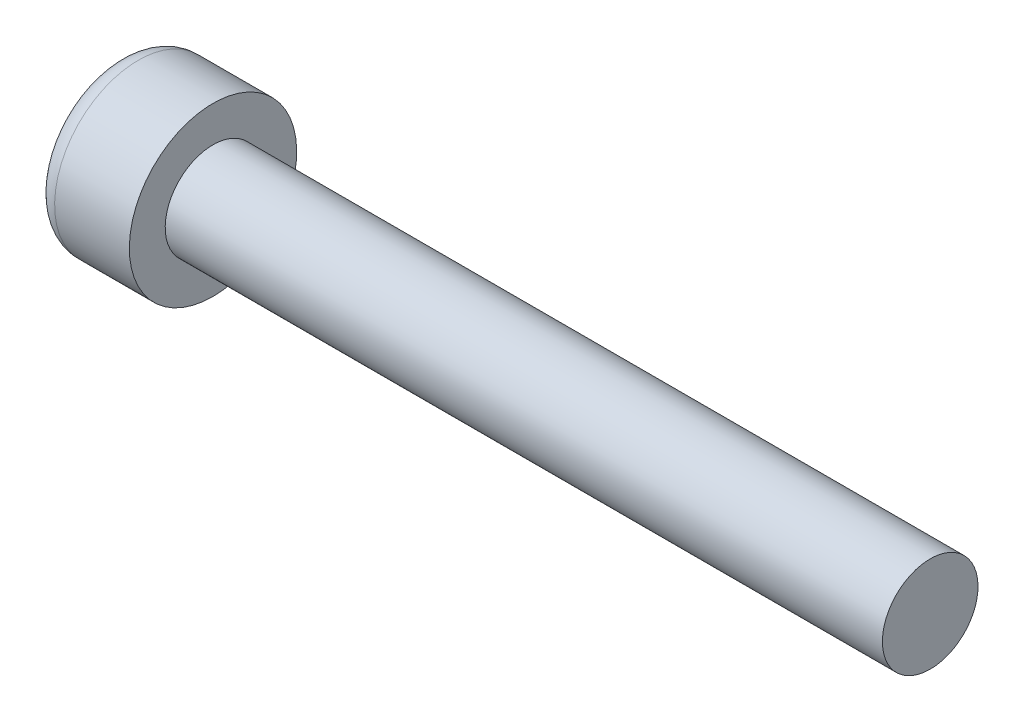
ISO-10303-21;
HEADER;
FILE_DESCRIPTION(('STEP AP214'),'2;1');
FILE_NAME('part.step','',(''),(''),'','','');
FILE_SCHEMA(('AUTOMOTIVE_DESIGN { 1 0 10303 214 1 1 1 1 }'));
ENDSEC;
DATA;
#1=APPLICATION_CONTEXT('core data for automotive mechanical design processes');
#2=APPLICATION_PROTOCOL_DEFINITION('international standard','automotive_design',2000,#1);
#3=PRODUCT_CONTEXT('',#1,'mechanical');
#4=PRODUCT('Part','Part','',(#3));
#5=PRODUCT_RELATED_PRODUCT_CATEGORY('part','',(#4));
#6=PRODUCT_DEFINITION_FORMATION('','',#4);
#7=PRODUCT_DEFINITION_CONTEXT('part definition',#1,'design');
#8=PRODUCT_DEFINITION('design','',#6,#7);
#9=PRODUCT_DEFINITION_SHAPE('','',#8);
#10=(LENGTH_UNIT() NAMED_UNIT(*) SI_UNIT(.MILLI.,.METRE.));
#11=(NAMED_UNIT(*) PLANE_ANGLE_UNIT() SI_UNIT($,.RADIAN.));
#12=(NAMED_UNIT(*) SI_UNIT($,.STERADIAN.) SOLID_ANGLE_UNIT());
#13=UNCERTAINTY_MEASURE_WITH_UNIT(LENGTH_MEASURE(1.E-05),#10,'distance_accuracy_value','');
#14=(GEOMETRIC_REPRESENTATION_CONTEXT(3) GLOBAL_UNCERTAINTY_ASSIGNED_CONTEXT((#13)) GLOBAL_UNIT_ASSIGNED_CONTEXT((#10,
#11,#12)) REPRESENTATION_CONTEXT('',''));
#15=CARTESIAN_POINT('',(0.,0.,0.));
#16=DIRECTION('',(0.,0.,1.));
#17=DIRECTION('',(1.,0.,0.));
#18=AXIS2_PLACEMENT_3D('',#15,#16,#17);
#19=CARTESIAN_POINT('',(0.,0.,0.));
#20=DIRECTION('',(1.,0.,0.));
#21=DIRECTION('',(0.,1.,0.));
#22=AXIS2_PLACEMENT_3D('',#19,#20,#21);
#23=PLANE('',#22);
#24=DIRECTION('',(0.,-0.5,-0.866025403784439));
#25=VECTOR('',#24,1.);
#26=CARTESIAN_POINT('',(0.,1.73205080756888,0.));
#27=LINE('',#26,#25);
#28=CARTESIAN_POINT('',(0.,1.73205080756888,0.));
#29=VERTEX_POINT('',#28);
#30=CARTESIAN_POINT('',(0.,0.866025403784439,-1.5));
#31=VERTEX_POINT('',#30);
#32=EDGE_CURVE('E123',#29,#31,#27,.T.);
#33=ORIENTED_EDGE('',*,*,#32,.F.);
#34=DIRECTION('',(0.,0.5,-0.866025403784439));
#35=VECTOR('',#34,1.);
#36=CARTESIAN_POINT('',(0.,0.866025403784439,1.5));
#37=LINE('',#36,#35);
#38=CARTESIAN_POINT('',(0.,0.866025403784439,1.5));
#39=VERTEX_POINT('',#38);
#40=EDGE_CURVE('E49',#39,#29,#37,.T.);
#41=ORIENTED_EDGE('',*,*,#40,.F.);
#42=DIRECTION('',(0.,1.,0.));
#43=VECTOR('',#42,1.);
#44=CARTESIAN_POINT('',(0.,-0.866025403784439,1.5));
#45=LINE('',#44,#43);
#46=CARTESIAN_POINT('',(0.,-0.866025403784439,1.5));
#47=VERTEX_POINT('',#46);
#48=EDGE_CURVE('E132',#47,#39,#45,.T.);
#49=ORIENTED_EDGE('',*,*,#48,.F.);
#50=DIRECTION('',(0.,0.5,0.866025403784439));
#51=VECTOR('',#50,1.);
#52=CARTESIAN_POINT('',(0.,-1.73205080756888,0.));
#53=LINE('',#52,#51);
#54=CARTESIAN_POINT('',(0.,-1.73205080756888,0.));
#55=VERTEX_POINT('',#54);
#56=EDGE_CURVE('E130',#55,#47,#53,.T.);
#57=ORIENTED_EDGE('',*,*,#56,.F.);
#58=DIRECTION('',(0.,-0.5,0.866025403784439));
#59=VECTOR('',#58,1.);
#60=CARTESIAN_POINT('',(0.,-0.866025403784439,-1.5));
#61=LINE('',#60,#59);
#62=CARTESIAN_POINT('',(0.,-0.866025403784439,-1.5));
#63=VERTEX_POINT('',#62);
#64=EDGE_CURVE('E97',#63,#55,#61,.T.);
#65=ORIENTED_EDGE('',*,*,#64,.F.);
#66=DIRECTION('',(0.,-1.,0.));
#67=VECTOR('',#66,1.);
#68=CARTESIAN_POINT('',(0.,0.866025403784439,-1.5));
#69=LINE('',#68,#67);
#70=EDGE_CURVE('E126',#31,#63,#69,.T.);
#71=ORIENTED_EDGE('',*,*,#70,.F.);
#72=EDGE_LOOP('',(#33,#41,#49,#57,#65,#71));
#73=FACE_BOUND('',#72,.T.);
#74=CARTESIAN_POINT('',(0.,0.,0.));
#75=DIRECTION('',(-1.,0.,0.));
#76=DIRECTION('',(0.,-1.,0.));
#77=AXIS2_PLACEMENT_3D('',#74,#75,#76);
#78=CIRCLE('',#77,2.625);
#79=CARTESIAN_POINT('',(0.,-2.625,0.));
#80=VERTEX_POINT('',#79);
#81=EDGE_CURVE('E11',#80,#80,#78,.T.);
#82=ORIENTED_EDGE('',*,*,#81,.T.);
#83=EDGE_LOOP('',(#82));
#84=FACE_BOUND('',#83,.T.);
#85=ADVANCED_FACE('F35',(#73,#84),#23,.F.);
#86=CARTESIAN_POINT('',(0.875,0.,0.));
#87=DIRECTION('',(-1.,0.,0.));
#88=DIRECTION('',(0.,-1.,0.));
#89=AXIS2_PLACEMENT_3D('',#86,#87,#88);
#90=TOROIDAL_SURFACE('',#89,2.625,0.875);
#91=ORIENTED_EDGE('',*,*,#81,.F.);
#92=EDGE_LOOP('',(#91));
#93=FACE_BOUND('',#92,.T.);
#94=CARTESIAN_POINT('',(0.875,0.,0.));
#95=DIRECTION('',(-1.,0.,0.));
#96=DIRECTION('',(0.,-1.,0.));
#97=AXIS2_PLACEMENT_3D('',#94,#95,#96);
#98=CIRCLE('',#97,3.5);
#99=CARTESIAN_POINT('',(0.875000000000001,-3.5,0.));
#100=VERTEX_POINT('',#99);
#101=EDGE_CURVE('E42',#100,#100,#98,.T.);
#102=ORIENTED_EDGE('',*,*,#101,.T.);
#103=EDGE_LOOP('',(#102));
#104=FACE_BOUND('',#103,.T.);
#105=ADVANCED_FACE('F152',(#93,#104),#90,.T.);
#106=CARTESIAN_POINT('',(0.,0.,0.));
#107=DIRECTION('',(-1.,0.,0.));
#108=DIRECTION('',(0.,-1.,0.));
#109=AXIS2_PLACEMENT_3D('',#106,#107,#108);
#110=CYLINDRICAL_SURFACE('',#109,3.5);
#111=ORIENTED_EDGE('',*,*,#101,.F.);
#112=EDGE_LOOP('',(#111));
#113=FACE_BOUND('',#112,.T.);
#114=CARTESIAN_POINT('',(4.,0.,0.));
#115=DIRECTION('',(-1.,0.,0.));
#116=DIRECTION('',(0.,-1.,0.));
#117=AXIS2_PLACEMENT_3D('',#114,#115,#116);
#118=CIRCLE('',#117,3.5);
#119=CARTESIAN_POINT('',(4.,-3.5,0.));
#120=VERTEX_POINT('',#119);
#121=EDGE_CURVE('E147',#120,#120,#118,.T.);
#122=ORIENTED_EDGE('',*,*,#121,.T.);
#123=EDGE_LOOP('',(#122));
#124=FACE_BOUND('',#123,.T.);
#125=ADVANCED_FACE('F154',(#113,#124),#110,.T.);
#126=CARTESIAN_POINT('',(4.,3.5,0.));
#127=DIRECTION('',(-1.,0.,0.));
#128=DIRECTION('',(0.,-1.,0.));
#129=AXIS2_PLACEMENT_3D('',#126,#127,#128);
#130=PLANE('',#129);
#131=ORIENTED_EDGE('',*,*,#121,.F.);
#132=EDGE_LOOP('',(#131));
#133=FACE_BOUND('',#132,.T.);
#134=CARTESIAN_POINT('',(4.,0.,0.));
#135=DIRECTION('',(-1.,0.,0.));
#136=DIRECTION('',(0.,-1.,0.));
#137=AXIS2_PLACEMENT_3D('',#134,#135,#136);
#138=CIRCLE('',#137,2.);
#139=CARTESIAN_POINT('',(4.,-2.,0.));
#140=VERTEX_POINT('',#139);
#141=EDGE_CURVE('E144',#140,#140,#138,.T.);
#142=ORIENTED_EDGE('',*,*,#141,.T.);
#143=EDGE_LOOP('',(#142));
#144=FACE_BOUND('',#143,.T.);
#145=ADVANCED_FACE('F157',(#133,#144),#130,.F.);
#146=CARTESIAN_POINT('',(0.,0.,0.));
#147=DIRECTION('',(-1.,0.,0.));
#148=DIRECTION('',(0.,-1.,0.));
#149=AXIS2_PLACEMENT_3D('',#146,#147,#148);
#150=CYLINDRICAL_SURFACE('',#149,2.);
#151=ORIENTED_EDGE('',*,*,#141,.F.);
#152=EDGE_LOOP('',(#151));
#153=FACE_BOUND('',#152,.T.);
#154=CARTESIAN_POINT('',(34.,0.,0.));
#155=DIRECTION('',(-1.,0.,0.));
#156=DIRECTION('',(0.,-1.,0.));
#157=AXIS2_PLACEMENT_3D('',#154,#155,#156);
#158=CIRCLE('',#157,1.99999999999999);
#159=CARTESIAN_POINT('',(34.,-1.99999999999999,0.));
#160=VERTEX_POINT('',#159);
#161=EDGE_CURVE('E136',#160,#160,#158,.T.);
#162=ORIENTED_EDGE('',*,*,#161,.T.);
#163=EDGE_LOOP('',(#162));
#164=FACE_BOUND('',#163,.T.);
#165=ADVANCED_FACE('F163',(#153,#164),#150,.T.);
#166=CARTESIAN_POINT('',(34.,2.,0.));
#167=DIRECTION('',(-1.,0.,0.));
#168=DIRECTION('',(0.,-1.,0.));
#169=AXIS2_PLACEMENT_3D('',#166,#167,#168);
#170=PLANE('',#169);
#171=ORIENTED_EDGE('',*,*,#161,.F.);
#172=EDGE_LOOP('',(#171));
#173=FACE_BOUND('',#172,.T.);
#174=ADVANCED_FACE('F169',(#173),#170,.F.);
#175=CARTESIAN_POINT('',(2.,0.866025403784439,1.5));
#176=DIRECTION('',(0.,0.866025403784439,0.5));
#177=DIRECTION('',(0.,-0.5,0.866025403784439));
#178=AXIS2_PLACEMENT_3D('',#175,#176,#177);
#179=PLANE('',#178);
#180=ORIENTED_EDGE('',*,*,#40,.T.);
#181=DIRECTION('',(-1.,0.,0.));
#182=VECTOR('',#181,1.);
#183=CARTESIAN_POINT('',(2.,1.73205080756888,0.));
#184=LINE('',#183,#182);
#185=CARTESIAN_POINT('',(2.,1.73205080756888,0.));
#186=VERTEX_POINT('',#185);
#187=EDGE_CURVE('E79',#186,#29,#184,.T.);
#188=ORIENTED_EDGE('',*,*,#187,.F.);
#189=DIRECTION('',(0.,0.5,-0.866025403784439));
#190=VECTOR('',#189,1.);
#191=CARTESIAN_POINT('',(2.,0.866025403784439,1.5));
#192=LINE('',#191,#190);
#193=CARTESIAN_POINT('',(2.,0.866025403784439,1.5));
#194=VERTEX_POINT('',#193);
#195=EDGE_CURVE('E134',#194,#186,#192,.T.);
#196=ORIENTED_EDGE('',*,*,#195,.F.);
#197=DIRECTION('',(-1.,0.,0.));
#198=VECTOR('',#197,1.);
#199=CARTESIAN_POINT('',(2.,0.866025403784439,1.5));
#200=LINE('',#199,#198);
#201=EDGE_CURVE('E57',#194,#39,#200,.T.);
#202=ORIENTED_EDGE('',*,*,#201,.T.);
#203=EDGE_LOOP('',(#180,#188,#196,#202));
#204=FACE_BOUND('',#203,.T.);
#205=ADVANCED_FACE('F174',(#204),#179,.F.);
#206=CARTESIAN_POINT('',(2.,-0.866025403784439,1.5));
#207=DIRECTION('',(0.,0.,1.));
#208=DIRECTION('',(0.,-1.,0.));
#209=AXIS2_PLACEMENT_3D('',#206,#207,#208);
#210=PLANE('',#209);
#211=ORIENTED_EDGE('',*,*,#48,.T.);
#212=ORIENTED_EDGE('',*,*,#201,.F.);
#213=DIRECTION('',(0.,1.,0.));
#214=VECTOR('',#213,1.);
#215=CARTESIAN_POINT('',(2.,-0.866025403784439,1.5));
#216=LINE('',#215,#214);
#217=CARTESIAN_POINT('',(2.,-0.866025403784439,1.5));
#218=VERTEX_POINT('',#217);
#219=EDGE_CURVE('E109',#218,#194,#216,.T.);
#220=ORIENTED_EDGE('',*,*,#219,.F.);
#221=DIRECTION('',(-1.,0.,0.));
#222=VECTOR('',#221,1.);
#223=CARTESIAN_POINT('',(2.,-0.866025403784439,1.5));
#224=LINE('',#223,#222);
#225=EDGE_CURVE('E101',#218,#47,#224,.T.);
#226=ORIENTED_EDGE('',*,*,#225,.T.);
#227=EDGE_LOOP('',(#211,#212,#220,#226));
#228=FACE_BOUND('',#227,.T.);
#229=ADVANCED_FACE('F179',(#228),#210,.F.);
#230=CARTESIAN_POINT('',(2.,-1.73205080756888,0.));
#231=DIRECTION('',(0.,-0.866025403784439,0.5));
#232=DIRECTION('',(0.,-0.5,-0.866025403784439));
#233=AXIS2_PLACEMENT_3D('',#230,#231,#232);
#234=PLANE('',#233);
#235=ORIENTED_EDGE('',*,*,#56,.T.);
#236=ORIENTED_EDGE('',*,*,#225,.F.);
#237=DIRECTION('',(0.,0.5,0.866025403784439));
#238=VECTOR('',#237,1.);
#239=CARTESIAN_POINT('',(2.,-1.73205080756888,0.));
#240=LINE('',#239,#238);
#241=CARTESIAN_POINT('',(2.,-1.73205080756888,0.));
#242=VERTEX_POINT('',#241);
#243=EDGE_CURVE('E105',#242,#218,#240,.T.);
#244=ORIENTED_EDGE('',*,*,#243,.F.);
#245=DIRECTION('',(-1.,0.,0.));
#246=VECTOR('',#245,1.);
#247=CARTESIAN_POINT('',(2.,-1.73205080756888,0.));
#248=LINE('',#247,#246);
#249=EDGE_CURVE('E90',#242,#55,#248,.T.);
#250=ORIENTED_EDGE('',*,*,#249,.T.);
#251=EDGE_LOOP('',(#235,#236,#244,#250));
#252=FACE_BOUND('',#251,.T.);
#253=ADVANCED_FACE('F106',(#252),#234,.F.);
#254=CARTESIAN_POINT('',(2.,-0.866025403784439,-1.5));
#255=DIRECTION('',(0.,-0.866025403784439,-0.5));
#256=DIRECTION('',(0.,0.5,-0.866025403784439));
#257=AXIS2_PLACEMENT_3D('',#254,#255,#256);
#258=PLANE('',#257);
#259=ORIENTED_EDGE('',*,*,#64,.T.);
#260=ORIENTED_EDGE('',*,*,#249,.F.);
#261=DIRECTION('',(0.,-0.5,0.866025403784439));
#262=VECTOR('',#261,1.);
#263=CARTESIAN_POINT('',(2.,-0.866025403784439,-1.5));
#264=LINE('',#263,#262);
#265=CARTESIAN_POINT('',(2.,-0.866025403784439,-1.5));
#266=VERTEX_POINT('',#265);
#267=EDGE_CURVE('E94',#266,#242,#264,.T.);
#268=ORIENTED_EDGE('',*,*,#267,.F.);
#269=DIRECTION('',(-1.,0.,0.));
#270=VECTOR('',#269,1.);
#271=CARTESIAN_POINT('',(2.,-0.866025403784439,-1.5));
#272=LINE('',#271,#270);
#273=EDGE_CURVE('E102',#266,#63,#272,.T.);
#274=ORIENTED_EDGE('',*,*,#273,.T.);
#275=EDGE_LOOP('',(#259,#260,#268,#274));
#276=FACE_BOUND('',#275,.T.);
#277=ADVANCED_FACE('F92',(#276),#258,.F.);
#278=CARTESIAN_POINT('',(2.,0.866025403784439,-1.5));
#279=DIRECTION('',(0.,0.,-1.));
#280=DIRECTION('',(-1.,0.,0.));
#281=AXIS2_PLACEMENT_3D('',#278,#279,#280);
#282=PLANE('',#281);
#283=ORIENTED_EDGE('',*,*,#70,.T.);
#284=ORIENTED_EDGE('',*,*,#273,.F.);
#285=DIRECTION('',(0.,-1.,0.));
#286=VECTOR('',#285,1.);
#287=CARTESIAN_POINT('',(2.,0.866025403784439,-1.5));
#288=LINE('',#287,#286);
#289=CARTESIAN_POINT('',(2.,0.866025403784439,-1.5));
#290=VERTEX_POINT('',#289);
#291=EDGE_CURVE('E115',#290,#266,#288,.T.);
#292=ORIENTED_EDGE('',*,*,#291,.F.);
#293=DIRECTION('',(-1.,0.,0.));
#294=VECTOR('',#293,1.);
#295=CARTESIAN_POINT('',(2.,0.866025403784439,-1.5));
#296=LINE('',#295,#294);
#297=EDGE_CURVE('E139',#290,#31,#296,.T.);
#298=ORIENTED_EDGE('',*,*,#297,.T.);
#299=EDGE_LOOP('',(#283,#284,#292,#298));
#300=FACE_BOUND('',#299,.T.);
#301=ADVANCED_FACE('F205',(#300),#282,.F.);
#302=CARTESIAN_POINT('',(2.,1.73205080756888,0.));
#303=DIRECTION('',(0.,0.866025403784439,-0.5));
#304=DIRECTION('',(0.,0.5,0.866025403784439));
#305=AXIS2_PLACEMENT_3D('',#302,#303,#304);
#306=PLANE('',#305);
#307=ORIENTED_EDGE('',*,*,#32,.T.);
#308=ORIENTED_EDGE('',*,*,#297,.F.);
#309=DIRECTION('',(0.,-0.5,-0.866025403784439));
#310=VECTOR('',#309,1.);
#311=CARTESIAN_POINT('',(2.,1.73205080756888,0.));
#312=LINE('',#311,#310);
#313=EDGE_CURVE('E117',#186,#290,#312,.T.);
#314=ORIENTED_EDGE('',*,*,#313,.F.);
#315=ORIENTED_EDGE('',*,*,#187,.T.);
#316=EDGE_LOOP('',(#307,#308,#314,#315));
#317=FACE_BOUND('',#316,.T.);
#318=ADVANCED_FACE('F193',(#317),#306,.F.);
#319=CARTESIAN_POINT('',(2.,0.,0.));
#320=DIRECTION('',(-1.,0.,0.));
#321=DIRECTION('',(0.,-1.,0.));
#322=AXIS2_PLACEMENT_3D('',#319,#320,#321);
#323=PLANE('',#322);
#324=ORIENTED_EDGE('',*,*,#195,.T.);
#325=ORIENTED_EDGE('',*,*,#313,.T.);
#326=ORIENTED_EDGE('',*,*,#291,.T.);
#327=ORIENTED_EDGE('',*,*,#267,.T.);
#328=ORIENTED_EDGE('',*,*,#243,.T.);
#329=ORIENTED_EDGE('',*,*,#219,.T.);
#330=EDGE_LOOP('',(#324,#325,#326,#327,#328,#329));
#331=FACE_BOUND('',#330,.T.);
#332=ADVANCED_FACE('F112',(#331),#323,.T.);
#333=CLOSED_SHELL('',(#85,#105,#125,#145,#165,#174,#205,#229,#253,#277,#301,#318,#332));
#334=MANIFOLD_SOLID_BREP('B2',#333);
#335=ADVANCED_BREP_SHAPE_REPRESENTATION('',(#18,#334),#14);
#336=SHAPE_DEFINITION_REPRESENTATION(#9,#335);
ENDSEC;
END-ISO-10303-21;
